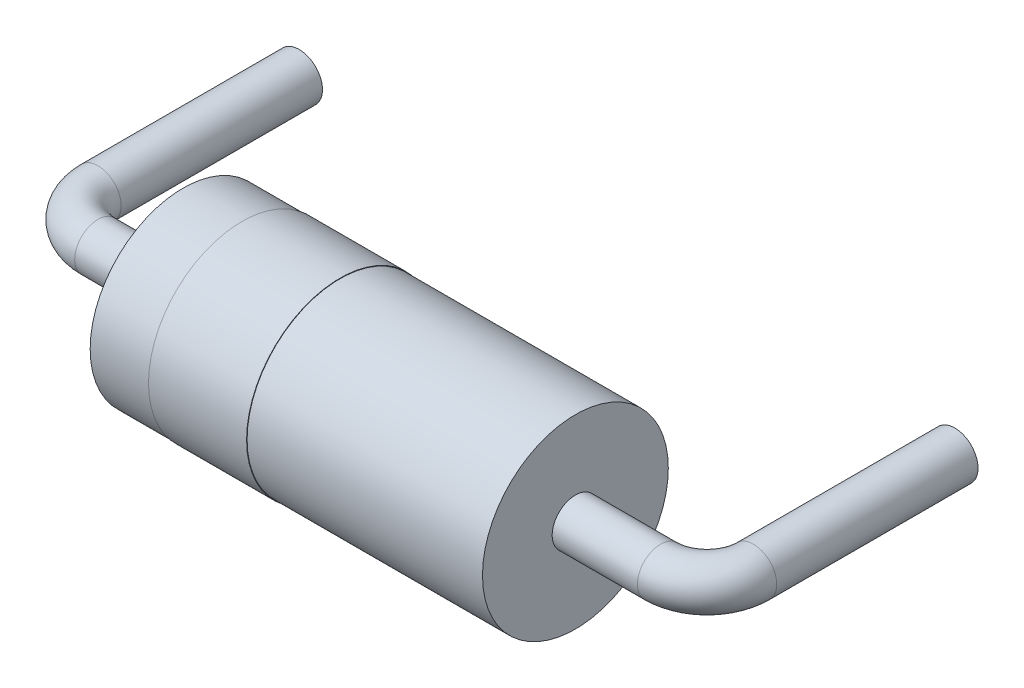
ISO-10303-21;
HEADER;
FILE_DESCRIPTION(('STEP AP214'),'2;1');
FILE_NAME('part.step','',(''),(''),'','','');
FILE_SCHEMA(('AUTOMOTIVE_DESIGN { 1 0 10303 214 1 1 1 1 }'));
ENDSEC;
DATA;
#1=APPLICATION_CONTEXT('core data for automotive mechanical design processes');
#2=APPLICATION_PROTOCOL_DEFINITION('international standard','automotive_design',2000,#1);
#3=PRODUCT_CONTEXT('',#1,'mechanical');
#4=PRODUCT('Part','Part','',(#3));
#5=PRODUCT_RELATED_PRODUCT_CATEGORY('part','',(#4));
#6=PRODUCT_DEFINITION_FORMATION('','',#4);
#7=PRODUCT_DEFINITION_CONTEXT('part definition',#1,'design');
#8=PRODUCT_DEFINITION('design','',#6,#7);
#9=PRODUCT_DEFINITION_SHAPE('','',#8);
#10=(LENGTH_UNIT() NAMED_UNIT(*) SI_UNIT(.MILLI.,.METRE.));
#11=(NAMED_UNIT(*) PLANE_ANGLE_UNIT() SI_UNIT($,.RADIAN.));
#12=(NAMED_UNIT(*) SI_UNIT($,.STERADIAN.) SOLID_ANGLE_UNIT());
#13=UNCERTAINTY_MEASURE_WITH_UNIT(LENGTH_MEASURE(1.E-05),#10,'distance_accuracy_value','');
#14=(GEOMETRIC_REPRESENTATION_CONTEXT(3) GLOBAL_UNCERTAINTY_ASSIGNED_CONTEXT((#13)) GLOBAL_UNIT_ASSIGNED_CONTEXT((#10,
#11,#12)) REPRESENTATION_CONTEXT('',''));
#15=CARTESIAN_POINT('',(0.,0.,0.));
#16=DIRECTION('',(0.,0.,1.));
#17=DIRECTION('',(1.,0.,0.));
#18=AXIS2_PLACEMENT_3D('',#15,#16,#17);
#19=CARTESIAN_POINT('',(0.,0.,1.4));
#20=DIRECTION('',(0.,0.,1.));
#21=DIRECTION('',(1.,0.,0.));
#22=AXIS2_PLACEMENT_3D('',#19,#20,#21);
#23=CYLINDRICAL_SURFACE('',#22,0.45);
#24=CARTESIAN_POINT('',(0.,0.,1.4));
#25=DIRECTION('',(0.,0.,1.));
#26=DIRECTION('',(1.,0.,0.));
#27=AXIS2_PLACEMENT_3D('',#24,#25,#26);
#28=CIRCLE('',#27,0.45);
#29=CARTESIAN_POINT('',(-0.45,0.,1.4));
#30=VERTEX_POINT('',#29);
#31=EDGE_CURVE('E28',#30,#30,#28,.T.);
#32=ORIENTED_EDGE('',*,*,#31,.F.);
#33=EDGE_LOOP('',(#32));
#34=FACE_BOUND('',#33,.T.);
#35=CARTESIAN_POINT('',(0.,0.,-2.5));
#36=DIRECTION('',(0.,0.,1.));
#37=DIRECTION('',(1.,0.,0.));
#38=AXIS2_PLACEMENT_3D('',#35,#36,#37);
#39=CIRCLE('',#38,0.45);
#40=CARTESIAN_POINT('',(0.45,0.,-2.5));
#41=VERTEX_POINT('',#40);
#42=EDGE_CURVE('E10',#41,#41,#39,.T.);
#43=ORIENTED_EDGE('',*,*,#42,.T.);
#44=EDGE_LOOP('',(#43));
#45=FACE_BOUND('',#44,.T.);
#46=ADVANCED_FACE('F15',(#34,#45),#23,.T.);
#47=CARTESIAN_POINT('',(0.45,0.,-2.5));
#48=DIRECTION('',(0.,0.,-1.));
#49=DIRECTION('',(-1.,0.,0.));
#50=AXIS2_PLACEMENT_3D('',#47,#48,#49);
#51=PLANE('',#50);
#52=ORIENTED_EDGE('',*,*,#42,.F.);
#53=EDGE_LOOP('',(#52));
#54=FACE_BOUND('',#53,.T.);
#55=ADVANCED_FACE('F78',(#54),#51,.T.);
#56=CARTESIAN_POINT('',(0.9,0.,1.4));
#57=DIRECTION('',(0.,1.,0.));
#58=DIRECTION('',(1.,0.,0.));
#59=AXIS2_PLACEMENT_3D('',#56,#57,#58);
#60=TOROIDAL_SURFACE('',#59,0.9,0.45);
#61=CARTESIAN_POINT('',(0.9,0.,2.3));
#62=DIRECTION('',(-1.,0.,0.));
#63=DIRECTION('',(0.,0.,1.));
#64=AXIS2_PLACEMENT_3D('',#61,#62,#63);
#65=CIRCLE('',#64,0.45);
#66=CARTESIAN_POINT('',(0.9,0.,2.75));
#67=VERTEX_POINT('',#66);
#68=EDGE_CURVE('E23',#67,#67,#65,.T.);
#69=CARTESIAN_POINT('',(0.9,0.,1.4));
#70=DIRECTION('',(0.,1.,0.));
#71=DIRECTION('',(1.,0.,0.));
#72=AXIS2_PLACEMENT_3D('',#69,#70,#71);
#73=CIRCLE('',#72,1.35);
#74=EDGE_CURVE('',#30,#67,#73,.T.);
#75=ORIENTED_EDGE('',*,*,#31,.T.);
#76=ORIENTED_EDGE('',*,*,#68,.T.);
#77=ORIENTED_EDGE('',*,*,#74,.T.);
#78=ORIENTED_EDGE('',*,*,#74,.F.);
#79=EDGE_LOOP('',(#75,#77,#76,#78));
#80=FACE_BOUND('',#79,.T.);
#81=ADVANCED_FACE('F84',(#80),#60,.T.);
#82=CARTESIAN_POINT('',(0.9,0.,2.3));
#83=DIRECTION('',(1.,0.,0.));
#84=DIRECTION('',(0.,0.,-1.));
#85=AXIS2_PLACEMENT_3D('',#82,#83,#84);
#86=CYLINDRICAL_SURFACE('',#85,0.45);
#87=CARTESIAN_POINT('',(2.55,0.,2.3));
#88=DIRECTION('',(1.,0.,0.));
#89=DIRECTION('',(0.,0.,-1.));
#90=AXIS2_PLACEMENT_3D('',#87,#88,#89);
#91=CIRCLE('',#90,0.45);
#92=CARTESIAN_POINT('',(2.55,0.,1.85));
#93=VERTEX_POINT('',#92);
#94=EDGE_CURVE('E32',#93,#93,#91,.T.);
#95=ORIENTED_EDGE('',*,*,#94,.F.);
#96=EDGE_LOOP('',(#95));
#97=FACE_BOUND('',#96,.T.);
#98=ORIENTED_EDGE('',*,*,#68,.F.);
#99=EDGE_LOOP('',(#98));
#100=FACE_BOUND('',#99,.T.);
#101=ADVANCED_FACE('F91',(#97,#100),#86,.T.);
#102=CARTESIAN_POINT('',(2.55,0.,2.3));
#103=DIRECTION('',(1.,0.,0.));
#104=DIRECTION('',(0.,0.,1.));
#105=AXIS2_PLACEMENT_3D('',#102,#103,#104);
#106=PLANE('',#105);
#107=CARTESIAN_POINT('',(2.55,0.,2.3));
#108=DIRECTION('',(1.,0.,0.));
#109=DIRECTION('',(0.,0.,1.));
#110=AXIS2_PLACEMENT_3D('',#107,#108,#109);
#111=CIRCLE('',#110,1.8);
#112=CARTESIAN_POINT('',(2.55,0.,4.1));
#113=VERTEX_POINT('',#112);
#114=EDGE_CURVE('E35',#113,#113,#111,.T.);
#115=ORIENTED_EDGE('',*,*,#114,.F.);
#116=EDGE_LOOP('',(#115));
#117=FACE_BOUND('',#116,.T.);
#118=ORIENTED_EDGE('',*,*,#94,.T.);
#119=EDGE_LOOP('',(#118));
#120=FACE_BOUND('',#119,.T.);
#121=ADVANCED_FACE('F95',(#117,#120),#106,.F.);
#122=CARTESIAN_POINT('',(2.55,0.,2.3));
#123=DIRECTION('',(1.,0.,0.));
#124=DIRECTION('',(0.,0.,1.));
#125=AXIS2_PLACEMENT_3D('',#122,#123,#124);
#126=CYLINDRICAL_SURFACE('',#125,1.8);
#127=CARTESIAN_POINT('',(3.69,0.,2.3));
#128=DIRECTION('',(1.,0.,0.));
#129=DIRECTION('',(0.,0.,1.));
#130=AXIS2_PLACEMENT_3D('',#127,#128,#129);
#131=CIRCLE('',#130,1.8);
#132=CARTESIAN_POINT('',(3.69,0.,4.1));
#133=VERTEX_POINT('',#132);
#134=EDGE_CURVE('E38',#133,#133,#131,.T.);
#135=ORIENTED_EDGE('',*,*,#134,.F.);
#136=EDGE_LOOP('',(#135));
#137=FACE_BOUND('',#136,.T.);
#138=ORIENTED_EDGE('',*,*,#114,.T.);
#139=EDGE_LOOP('',(#138));
#140=FACE_BOUND('',#139,.T.);
#141=ADVANCED_FACE('F99',(#137,#140),#126,.T.);
#142=CARTESIAN_POINT('',(3.69,0.,2.3));
#143=DIRECTION('',(1.,0.,0.));
#144=DIRECTION('',(0.,0.,1.));
#145=AXIS2_PLACEMENT_3D('',#142,#143,#144);
#146=PLANE('',#145);
#147=CARTESIAN_POINT('',(3.69,0.,2.3));
#148=DIRECTION('',(1.,0.,0.));
#149=DIRECTION('',(0.,0.,1.));
#150=AXIS2_PLACEMENT_3D('',#147,#148,#149);
#151=CIRCLE('',#150,1.81);
#152=CARTESIAN_POINT('',(3.69,0.,4.11));
#153=VERTEX_POINT('',#152);
#154=EDGE_CURVE('E41',#153,#153,#151,.T.);
#155=ORIENTED_EDGE('',*,*,#154,.F.);
#156=EDGE_LOOP('',(#155));
#157=FACE_BOUND('',#156,.T.);
#158=ORIENTED_EDGE('',*,*,#134,.T.);
#159=EDGE_LOOP('',(#158));
#160=FACE_BOUND('',#159,.T.);
#161=ADVANCED_FACE('F103',(#157,#160),#146,.F.);
#162=CARTESIAN_POINT('',(3.69,0.,2.3));
#163=DIRECTION('',(1.,0.,0.));
#164=DIRECTION('',(0.,0.,1.));
#165=AXIS2_PLACEMENT_3D('',#162,#163,#164);
#166=CYLINDRICAL_SURFACE('',#165,1.81);
#167=CARTESIAN_POINT('',(5.59,0.,2.3));
#168=DIRECTION('',(1.,0.,0.));
#169=DIRECTION('',(0.,0.,1.));
#170=AXIS2_PLACEMENT_3D('',#167,#168,#169);
#171=CIRCLE('',#170,1.81);
#172=CARTESIAN_POINT('',(5.59,0.,4.11));
#173=VERTEX_POINT('',#172);
#174=EDGE_CURVE('E44',#173,#173,#171,.T.);
#175=ORIENTED_EDGE('',*,*,#174,.F.);
#176=EDGE_LOOP('',(#175));
#177=FACE_BOUND('',#176,.T.);
#178=ORIENTED_EDGE('',*,*,#154,.T.);
#179=EDGE_LOOP('',(#178));
#180=FACE_BOUND('',#179,.T.);
#181=ADVANCED_FACE('F107',(#177,#180),#166,.T.);
#182=CARTESIAN_POINT('',(5.59,0.,2.3));
#183=DIRECTION('',(1.,0.,0.));
#184=DIRECTION('',(0.,0.,1.));
#185=AXIS2_PLACEMENT_3D('',#182,#183,#184);
#186=PLANE('',#185);
#187=ORIENTED_EDGE('',*,*,#174,.T.);
#188=EDGE_LOOP('',(#187));
#189=FACE_BOUND('',#188,.T.);
#190=CARTESIAN_POINT('',(5.59,0.,2.3));
#191=DIRECTION('',(1.,0.,0.));
#192=DIRECTION('',(0.,0.,1.));
#193=AXIS2_PLACEMENT_3D('',#190,#191,#192);
#194=CIRCLE('',#193,1.8);
#195=CARTESIAN_POINT('',(5.59,0.,4.1));
#196=VERTEX_POINT('',#195);
#197=EDGE_CURVE('E47',#196,#196,#194,.T.);
#198=ORIENTED_EDGE('',*,*,#197,.F.);
#199=EDGE_LOOP('',(#198));
#200=FACE_BOUND('',#199,.T.);
#201=ADVANCED_FACE('F111',(#189,#200),#186,.T.);
#202=CARTESIAN_POINT('',(2.55,0.,2.3));
#203=DIRECTION('',(1.,0.,0.));
#204=DIRECTION('',(0.,0.,1.));
#205=AXIS2_PLACEMENT_3D('',#202,#203,#204);
#206=CYLINDRICAL_SURFACE('',#205,1.8);
#207=CARTESIAN_POINT('',(10.15,0.,2.3));
#208=DIRECTION('',(1.,0.,0.));
#209=DIRECTION('',(0.,0.,1.));
#210=AXIS2_PLACEMENT_3D('',#207,#208,#209);
#211=CIRCLE('',#210,1.8);
#212=CARTESIAN_POINT('',(10.15,0.,4.1));
#213=VERTEX_POINT('',#212);
#214=EDGE_CURVE('E50',#213,#213,#211,.T.);
#215=ORIENTED_EDGE('',*,*,#214,.F.);
#216=EDGE_LOOP('',(#215));
#217=FACE_BOUND('',#216,.T.);
#218=ORIENTED_EDGE('',*,*,#197,.T.);
#219=EDGE_LOOP('',(#218));
#220=FACE_BOUND('',#219,.T.);
#221=ADVANCED_FACE('F115',(#217,#220),#206,.T.);
#222=CARTESIAN_POINT('',(10.15,0.,2.3));
#223=DIRECTION('',(1.,0.,0.));
#224=DIRECTION('',(0.,0.,1.));
#225=AXIS2_PLACEMENT_3D('',#222,#223,#224);
#226=PLANE('',#225);
#227=ORIENTED_EDGE('',*,*,#214,.T.);
#228=EDGE_LOOP('',(#227));
#229=FACE_BOUND('',#228,.T.);
#230=CARTESIAN_POINT('',(10.15,0.,2.3));
#231=DIRECTION('',(1.,0.,0.));
#232=DIRECTION('',(0.,0.,-1.));
#233=AXIS2_PLACEMENT_3D('',#230,#231,#232);
#234=CIRCLE('',#233,0.45);
#235=CARTESIAN_POINT('',(10.15,0.,1.85));
#236=VERTEX_POINT('',#235);
#237=EDGE_CURVE('E53',#236,#236,#234,.T.);
#238=ORIENTED_EDGE('',*,*,#237,.F.);
#239=EDGE_LOOP('',(#238));
#240=FACE_BOUND('',#239,.T.);
#241=ADVANCED_FACE('F119',(#229,#240),#226,.T.);
#242=CARTESIAN_POINT('',(0.9,0.,2.3));
#243=DIRECTION('',(1.,0.,0.));
#244=DIRECTION('',(0.,0.,-1.));
#245=AXIS2_PLACEMENT_3D('',#242,#243,#244);
#246=CYLINDRICAL_SURFACE('',#245,0.45);
#247=CARTESIAN_POINT('',(11.8,0.,2.3));
#248=DIRECTION('',(1.,0.,0.));
#249=DIRECTION('',(0.,0.,-1.));
#250=AXIS2_PLACEMENT_3D('',#247,#248,#249);
#251=CIRCLE('',#250,0.45);
#252=CARTESIAN_POINT('',(11.8,0.,2.75));
#253=VERTEX_POINT('',#252);
#254=EDGE_CURVE('E57',#253,#253,#251,.T.);
#255=ORIENTED_EDGE('',*,*,#254,.F.);
#256=EDGE_LOOP('',(#255));
#257=FACE_BOUND('',#256,.T.);
#258=ORIENTED_EDGE('',*,*,#237,.T.);
#259=EDGE_LOOP('',(#258));
#260=FACE_BOUND('',#259,.T.);
#261=ADVANCED_FACE('F74',(#257,#260),#246,.T.);
#262=CARTESIAN_POINT('',(11.8,0.,1.4));
#263=DIRECTION('',(0.,1.,0.));
#264=DIRECTION('',(1.,0.,0.));
#265=AXIS2_PLACEMENT_3D('',#262,#263,#264);
#266=TOROIDAL_SURFACE('',#265,0.9,0.45);
#267=CARTESIAN_POINT('',(12.7,0.,1.4));
#268=DIRECTION('',(0.,0.,1.));
#269=DIRECTION('',(1.,0.,0.));
#270=AXIS2_PLACEMENT_3D('',#267,#268,#269);
#271=CIRCLE('',#270,0.45);
#272=CARTESIAN_POINT('',(13.15,0.,1.4));
#273=VERTEX_POINT('',#272);
#274=EDGE_CURVE('E56',#273,#273,#271,.T.);
#275=CARTESIAN_POINT('',(11.8,0.,1.4));
#276=DIRECTION('',(0.,1.,0.));
#277=DIRECTION('',(1.,0.,0.));
#278=AXIS2_PLACEMENT_3D('',#275,#276,#277);
#279=CIRCLE('',#278,1.35);
#280=EDGE_CURVE('',#253,#273,#279,.T.);
#281=ORIENTED_EDGE('',*,*,#254,.T.);
#282=ORIENTED_EDGE('',*,*,#274,.T.);
#283=ORIENTED_EDGE('',*,*,#280,.T.);
#284=ORIENTED_EDGE('',*,*,#280,.F.);
#285=EDGE_LOOP('',(#281,#283,#282,#284));
#286=FACE_BOUND('',#285,.T.);
#287=ADVANCED_FACE('F62',(#286),#266,.T.);
#288=CARTESIAN_POINT('',(12.7,0.,1.4));
#289=DIRECTION('',(0.,0.,-1.));
#290=DIRECTION('',(-1.,0.,0.));
#291=AXIS2_PLACEMENT_3D('',#288,#289,#290);
#292=CYLINDRICAL_SURFACE('',#291,0.45);
#293=CARTESIAN_POINT('',(12.7,0.,-2.5));
#294=DIRECTION('',(0.,0.,-1.));
#295=DIRECTION('',(-1.,0.,0.));
#296=AXIS2_PLACEMENT_3D('',#293,#294,#295);
#297=CIRCLE('',#296,0.45);
#298=CARTESIAN_POINT('',(12.25,0.,-2.5));
#299=VERTEX_POINT('',#298);
#300=EDGE_CURVE('E19',#299,#299,#297,.T.);
#301=ORIENTED_EDGE('',*,*,#300,.F.);
#302=EDGE_LOOP('',(#301));
#303=FACE_BOUND('',#302,.T.);
#304=ORIENTED_EDGE('',*,*,#274,.F.);
#305=EDGE_LOOP('',(#304));
#306=FACE_BOUND('',#305,.T.);
#307=ADVANCED_FACE('F65',(#303,#306),#292,.T.);
#308=CARTESIAN_POINT('',(12.25,0.,-2.5));
#309=DIRECTION('',(0.,0.,1.));
#310=DIRECTION('',(1.,0.,0.));
#311=AXIS2_PLACEMENT_3D('',#308,#309,#310);
#312=PLANE('',#311);
#313=ORIENTED_EDGE('',*,*,#300,.T.);
#314=EDGE_LOOP('',(#313));
#315=FACE_BOUND('',#314,.T.);
#316=ADVANCED_FACE('F17',(#315),#312,.F.);
#317=CLOSED_SHELL('',(#46,#55,#81,#101,#121,#141,#161,#181,#201,#221,#241,#261,#287,#307,#316));
#318=MANIFOLD_SOLID_BREP('B1',#317);
#319=ADVANCED_BREP_SHAPE_REPRESENTATION('',(#18,#318),#14);
#320=SHAPE_DEFINITION_REPRESENTATION(#9,#319);
ENDSEC;
END-ISO-10303-21;
